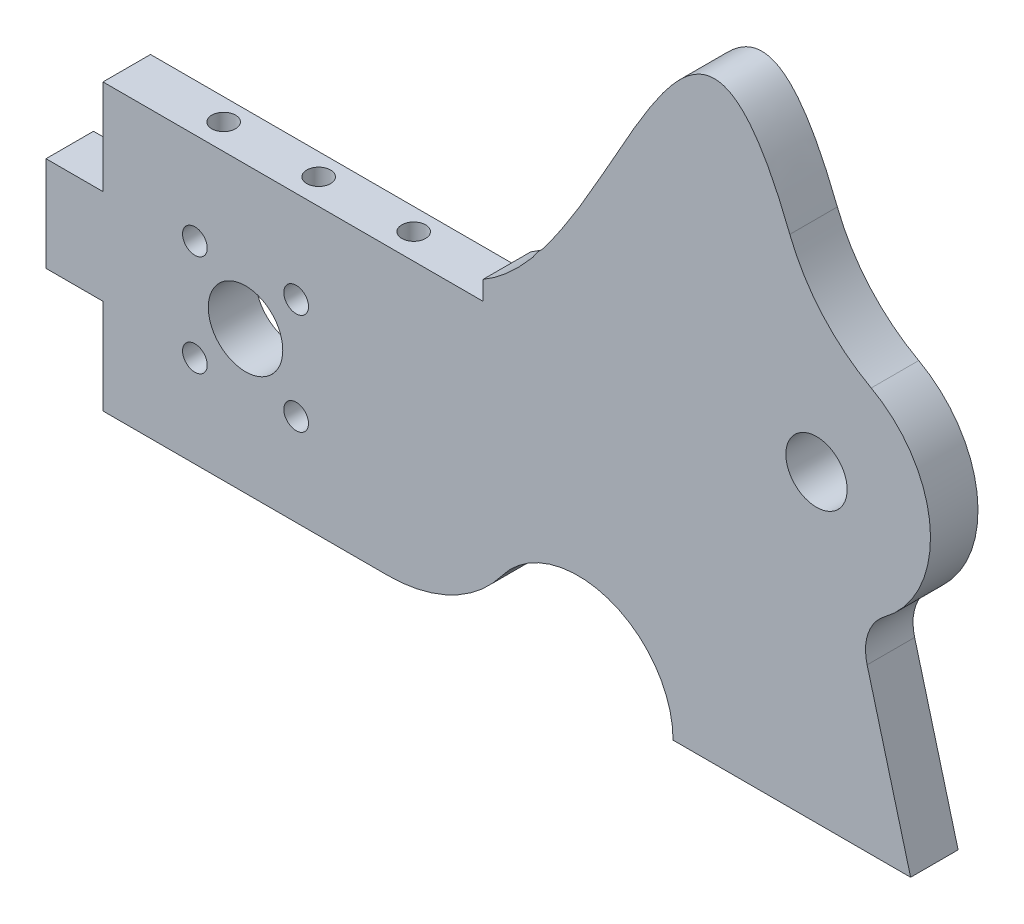
ISO-10303-21;
HEADER;
FILE_DESCRIPTION(('STEP AP214'),'2;1');
FILE_NAME('part.step','',(''),(''),'','','');
FILE_SCHEMA(('AUTOMOTIVE_DESIGN { 1 0 10303 214 1 1 1 1 }'));
ENDSEC;
DATA;
#1=APPLICATION_CONTEXT('core data for automotive mechanical design processes');
#2=APPLICATION_PROTOCOL_DEFINITION('international standard','automotive_design',2000,#1);
#3=PRODUCT_CONTEXT('',#1,'mechanical');
#4=PRODUCT('Part','Part','',(#3));
#5=PRODUCT_RELATED_PRODUCT_CATEGORY('part','',(#4));
#6=PRODUCT_DEFINITION_FORMATION('','',#4);
#7=PRODUCT_DEFINITION_CONTEXT('part definition',#1,'design');
#8=PRODUCT_DEFINITION('design','',#6,#7);
#9=PRODUCT_DEFINITION_SHAPE('','',#8);
#10=(LENGTH_UNIT() NAMED_UNIT(*) SI_UNIT(.MILLI.,.METRE.));
#11=(NAMED_UNIT(*) PLANE_ANGLE_UNIT() SI_UNIT($,.RADIAN.));
#12=(NAMED_UNIT(*) SI_UNIT($,.STERADIAN.) SOLID_ANGLE_UNIT());
#13=UNCERTAINTY_MEASURE_WITH_UNIT(LENGTH_MEASURE(1.E-05),#10,'distance_accuracy_value','');
#14=(GEOMETRIC_REPRESENTATION_CONTEXT(3) GLOBAL_UNCERTAINTY_ASSIGNED_CONTEXT((#13)) GLOBAL_UNIT_ASSIGNED_CONTEXT((#10,
#11,#12)) REPRESENTATION_CONTEXT('',''));
#15=CARTESIAN_POINT('',(0.,0.,0.));
#16=DIRECTION('',(0.,0.,1.));
#17=DIRECTION('',(1.,0.,0.));
#18=AXIS2_PLACEMENT_3D('',#15,#16,#17);
#19=CARTESIAN_POINT('',(0.,0.,6.35));
#20=DIRECTION('',(0.,1.,0.));
#21=DIRECTION('',(0.,0.,1.));
#22=AXIS2_PLACEMENT_3D('',#19,#20,#21);
#23=PLANE('',#22);
#24=CARTESIAN_POINT('',(31.75,0.,3.17500000000019));
#25=DIRECTION('',(0.,-1.,0.));
#26=DIRECTION('',(0.,0.,-1.));
#27=AXIS2_PLACEMENT_3D('',#24,#25,#26);
#28=CIRCLE('',#27,1.5875);
#29=CARTESIAN_POINT('',(31.75,0.,1.58750000000019));
#30=VERTEX_POINT('',#29);
#31=EDGE_CURVE('E523',#30,#30,#28,.T.);
#32=ORIENTED_EDGE('',*,*,#31,.F.);
#33=EDGE_LOOP('',(#32));
#34=FACE_BOUND('',#33,.T.);
#35=CARTESIAN_POINT('',(12.7,0.,3.17500000000019));
#36=DIRECTION('',(0.,-1.,0.));
#37=DIRECTION('',(0.,0.,-1.));
#38=AXIS2_PLACEMENT_3D('',#35,#36,#37);
#39=CIRCLE('',#38,1.5875);
#40=CARTESIAN_POINT('',(12.7,0.,1.58750000000019));
#41=VERTEX_POINT('',#40);
#42=EDGE_CURVE('E527',#41,#41,#39,.T.);
#43=ORIENTED_EDGE('',*,*,#42,.F.);
#44=EDGE_LOOP('',(#43));
#45=FACE_BOUND('',#44,.T.);
#46=DIRECTION('',(1.,0.,0.));
#47=VECTOR('',#46,1.);
#48=CARTESIAN_POINT('',(0.,0.,0.));
#49=LINE('',#48,#47);
#50=CARTESIAN_POINT('',(0.,0.,0.));
#51=VERTEX_POINT('',#50);
#52=CARTESIAN_POINT('',(38.1,0.,0.));
#53=VERTEX_POINT('',#52);
#54=EDGE_CURVE('E273',#51,#53,#49,.T.);
#55=ORIENTED_EDGE('',*,*,#54,.T.);
#56=DIRECTION('',(0.,0.,1.));
#57=VECTOR('',#56,1.);
#58=CARTESIAN_POINT('',(38.1,0.,6.35));
#59=LINE('',#58,#57);
#60=CARTESIAN_POINT('',(38.1,0.,6.35));
#61=VERTEX_POINT('',#60);
#62=EDGE_CURVE('E320',#53,#61,#59,.T.);
#63=ORIENTED_EDGE('',*,*,#62,.T.);
#64=DIRECTION('',(1.,0.,0.));
#65=VECTOR('',#64,1.);
#66=CARTESIAN_POINT('',(0.,0.,6.35));
#67=LINE('',#66,#65);
#68=CARTESIAN_POINT('',(0.,0.,6.35));
#69=VERTEX_POINT('',#68);
#70=EDGE_CURVE('E253',#69,#61,#67,.T.);
#71=ORIENTED_EDGE('',*,*,#70,.F.);
#72=DIRECTION('',(0.,0.,-1.));
#73=VECTOR('',#72,1.);
#74=CARTESIAN_POINT('',(0.,0.,6.35));
#75=LINE('',#74,#73);
#76=EDGE_CURVE('E305',#69,#51,#75,.T.);
#77=ORIENTED_EDGE('',*,*,#76,.T.);
#78=EDGE_LOOP('',(#55,#63,#71,#77));
#79=FACE_BOUND('',#78,.T.);
#80=ADVANCED_FACE('F34',(#34,#45,#79),#23,.F.);
#81=CARTESIAN_POINT('',(95.3674532925549,40.64,6.35));
#82=DIRECTION('',(0.,0.,1.));
#83=DIRECTION('',(1.,0.,0.));
#84=AXIS2_PLACEMENT_3D('',#81,#82,#83);
#85=PLANE('',#84);
#86=CARTESIAN_POINT('',(95.3674532925549,40.64,6.35));
#87=DIRECTION('',(0.,0.,1.));
#88=DIRECTION('',(1.,0.,0.));
#89=AXIS2_PLACEMENT_3D('',#86,#87,#88);
#90=CIRCLE('',#89,15.24);
#91=CARTESIAN_POINT('',(104.476824943284,28.4221054134157,6.35));
#92=VERTEX_POINT('',#91);
#93=CARTESIAN_POINT('',(102.682390609243,54.0097154813751,6.35));
#94=VERTEX_POINT('',#93);
#95=EDGE_CURVE('E259',#92,#94,#90,.T.);
#96=ORIENTED_EDGE('',*,*,#95,.T.);
#97=CARTESIAN_POINT('',(114.264374694,75.1784316602191,6.35));
#98=DIRECTION('',(0.,0.,1.));
#99=DIRECTION('',(1.,0.,0.));
#100=AXIS2_PLACEMENT_3D('',#97,#98,#99);
#101=CIRCLE('',#100,24.13);
#102=CARTESIAN_POINT('',(91.8054412375965,66.3549851680109,6.35));
#103=VERTEX_POINT('',#102);
#104=EDGE_CURVE('E11',#94,#103,#101,.F.);
#105=ORIENTED_EDGE('',*,*,#104,.T.);
#106=CARTESIAN_POINT('',(95.3674532925549,55.88,6.35));
#107=CARTESIAN_POINT('',(78.5942817419555,111.543427794669,6.35));
#108=CARTESIAN_POINT('',(70.7777889320371,52.1788036708753,6.35));
#109=CARTESIAN_POINT('',(50.8,40.64,6.35));
#110=B_SPLINE_CURVE_WITH_KNOTS('',3,(#106,#107,#108,#109),.UNSPECIFIED.,.F.,.F.,(4,4),(0.,1.),.UNSPECIFIED.);
#111=CARTESIAN_POINT('',(58.7253990221154,48.0986795360125,6.35));
#112=VERTEX_POINT('',#111);
#113=EDGE_CURVE('E170',#103,#112,#110,.T.);
#114=ORIENTED_EDGE('',*,*,#113,.T.);
#115=CARTESIAN_POINT('',(62.9766372231488,43.3817447518466,6.35));
#116=DIRECTION('',(0.,0.,1.));
#117=DIRECTION('',(1.,0.,0.));
#118=AXIS2_PLACEMENT_3D('',#115,#116,#117);
#119=CIRCLE('',#118,6.35);
#120=CARTESIAN_POINT('',(57.4616101020437,46.5292796370345,6.35));
#121=VERTEX_POINT('',#120);
#122=EDGE_CURVE('E178',#112,#121,#119,.T.);
#123=ORIENTED_EDGE('',*,*,#122,.T.);
#124=CARTESIAN_POINT('',(50.8000000000001,40.64,6.35));
#125=VERTEX_POINT('',#124);
#126=EDGE_CURVE('E816',#121,#125,#110,.T.);
#127=ORIENTED_EDGE('',*,*,#126,.T.);
#128=DIRECTION('',(0.,1.,0.));
#129=VECTOR('',#128,1.);
#130=CARTESIAN_POINT('',(50.8,38.1,6.35));
#131=LINE('',#130,#129);
#132=CARTESIAN_POINT('',(50.8,38.1,6.35));
#133=VERTEX_POINT('',#132);
#134=EDGE_CURVE('E177',#133,#125,#131,.T.);
#135=ORIENTED_EDGE('',*,*,#134,.F.);
#136=DIRECTION('',(1.,0.,0.));
#137=VECTOR('',#136,1.);
#138=CARTESIAN_POINT('',(0.,38.1,6.35));
#139=LINE('',#138,#137);
#140=CARTESIAN_POINT('',(0.,38.1,6.35));
#141=VERTEX_POINT('',#140);
#142=EDGE_CURVE('E819',#141,#133,#139,.T.);
#143=ORIENTED_EDGE('',*,*,#142,.F.);
#144=DIRECTION('',(0.,-1.,0.));
#145=VECTOR('',#144,1.);
#146=CARTESIAN_POINT('',(0.,38.1,6.35));
#147=LINE('',#146,#145);
#148=CARTESIAN_POINT('',(0.,25.4,6.35));
#149=VERTEX_POINT('',#148);
#150=EDGE_CURVE('E261',#141,#149,#147,.T.);
#151=ORIENTED_EDGE('',*,*,#150,.T.);
#152=DIRECTION('',(-1.,0.,0.));
#153=VECTOR('',#152,1.);
#154=CARTESIAN_POINT('',(0.,25.4,6.35));
#155=LINE('',#154,#153);
#156=CARTESIAN_POINT('',(-7.62,25.4,6.35));
#157=VERTEX_POINT('',#156);
#158=EDGE_CURVE('E263',#149,#157,#155,.T.);
#159=ORIENTED_EDGE('',*,*,#158,.T.);
#160=DIRECTION('',(0.,-1.,0.));
#161=VECTOR('',#160,1.);
#162=CARTESIAN_POINT('',(-7.62,25.4,6.35));
#163=LINE('',#162,#161);
#164=CARTESIAN_POINT('',(-7.62,12.7,6.35));
#165=VERTEX_POINT('',#164);
#166=EDGE_CURVE('E265',#157,#165,#163,.T.);
#167=ORIENTED_EDGE('',*,*,#166,.T.);
#168=DIRECTION('',(1.,0.,0.));
#169=VECTOR('',#168,1.);
#170=CARTESIAN_POINT('',(0.,12.7,6.35));
#171=LINE('',#170,#169);
#172=CARTESIAN_POINT('',(0.,12.7,6.35));
#173=VERTEX_POINT('',#172);
#174=EDGE_CURVE('E267',#165,#173,#171,.T.);
#175=ORIENTED_EDGE('',*,*,#174,.T.);
#176=DIRECTION('',(0.,-1.,0.));
#177=VECTOR('',#176,1.);
#178=CARTESIAN_POINT('',(0.,12.7,6.35));
#179=LINE('',#178,#177);
#180=EDGE_CURVE('E248',#173,#69,#179,.T.);
#181=ORIENTED_EDGE('',*,*,#180,.T.);
#182=ORIENTED_EDGE('',*,*,#70,.T.);
#183=CARTESIAN_POINT('',(38.1,19.05,6.35));
#184=DIRECTION('',(0.,0.,1.));
#185=DIRECTION('',(1.,0.,0.));
#186=AXIS2_PLACEMENT_3D('',#183,#184,#185);
#187=CIRCLE('',#186,19.05);
#188=CARTESIAN_POINT('',(53.34,7.62,6.35));
#189=VERTEX_POINT('',#188);
#190=EDGE_CURVE('E323',#61,#189,#187,.T.);
#191=ORIENTED_EDGE('',*,*,#190,.T.);
#192=CARTESIAN_POINT('',(63.5,0.,6.35));
#193=DIRECTION('',(0.,0.,1.));
#194=DIRECTION('',(1.,0.,0.));
#195=AXIS2_PLACEMENT_3D('',#192,#193,#194);
#196=CIRCLE('',#195,12.7);
#197=CARTESIAN_POINT('',(76.2,0.,6.35));
#198=VERTEX_POINT('',#197);
#199=EDGE_CURVE('E196',#198,#189,#196,.T.);
#200=ORIENTED_EDGE('',*,*,#199,.F.);
#201=CARTESIAN_POINT('',(107.95,0.,6.35));
#202=VERTEX_POINT('',#201);
#203=EDGE_CURVE('E251',#198,#202,#67,.T.);
#204=ORIENTED_EDGE('',*,*,#203,.T.);
#205=DIRECTION('',(-0.258819045102525,0.965925826289067,0.));
#206=VECTOR('',#205,1.);
#207=CARTESIAN_POINT('',(107.95,0.,6.35));
#208=LINE('',#207,#206);
#209=CARTESIAN_POINT('',(102.138767467486,21.6878150659382,6.35));
#210=VERTEX_POINT('',#209);
#211=EDGE_CURVE('E256',#202,#210,#208,.T.);
#212=ORIENTED_EDGE('',*,*,#211,.T.);
#213=CARTESIAN_POINT('',(108.272396464422,23.3313160023389,6.35));
#214=DIRECTION('',(0.,0.,1.));
#215=DIRECTION('',(1.,0.,0.));
#216=AXIS2_PLACEMENT_3D('',#213,#214,#215);
#217=CIRCLE('',#216,6.35);
#218=EDGE_CURVE('E179',#210,#92,#217,.F.);
#219=ORIENTED_EDGE('',*,*,#218,.T.);
#220=EDGE_LOOP('',(#96,#105,#114,#123,#127,#135,#143,#151,#159,#167,#175,#181,#182,#191,#200,
#204,#212,#219));
#221=FACE_BOUND('',#220,.T.);
#222=CARTESIAN_POINT('',(19.05,19.05,6.35));
#223=DIRECTION('',(0.,0.,1.));
#224=DIRECTION('',(1.,0.,0.));
#225=AXIS2_PLACEMENT_3D('',#222,#223,#224);
#226=CIRCLE('',#225,4.9784);
#227=CARTESIAN_POINT('',(24.0284,19.05,6.35));
#228=VERTEX_POINT('',#227);
#229=EDGE_CURVE('E186',#228,#228,#226,.T.);
#230=ORIENTED_EDGE('',*,*,#229,.F.);
#231=EDGE_LOOP('',(#230));
#232=FACE_BOUND('',#231,.T.);
#233=CARTESIAN_POINT('',(12.2829881040447,12.2829881040447,6.35));
#234=DIRECTION('',(0.,0.,1.));
#235=DIRECTION('',(1.,0.,0.));
#236=AXIS2_PLACEMENT_3D('',#233,#234,#235);
#237=CIRCLE('',#236,1.65099999999998);
#238=CARTESIAN_POINT('',(13.9339881040447,12.2829881040447,6.35));
#239=VERTEX_POINT('',#238);
#240=EDGE_CURVE('E224',#239,#239,#237,.T.);
#241=ORIENTED_EDGE('',*,*,#240,.F.);
#242=EDGE_LOOP('',(#241));
#243=FACE_BOUND('',#242,.T.);
#244=CARTESIAN_POINT('',(25.8170118959553,25.8170118959552,6.35));
#245=DIRECTION('',(0.,0.,1.));
#246=DIRECTION('',(1.,0.,0.));
#247=AXIS2_PLACEMENT_3D('',#244,#245,#246);
#248=CIRCLE('',#247,1.65099999999998);
#249=CARTESIAN_POINT('',(27.4680118959552,25.8170118959552,6.35));
#250=VERTEX_POINT('',#249);
#251=EDGE_CURVE('E236',#250,#250,#248,.T.);
#252=ORIENTED_EDGE('',*,*,#251,.F.);
#253=EDGE_LOOP('',(#252));
#254=FACE_BOUND('',#253,.T.);
#255=CARTESIAN_POINT('',(95.3674532925549,40.64,6.35));
#256=DIRECTION('',(0.,0.,1.));
#257=DIRECTION('',(1.,0.,0.));
#258=AXIS2_PLACEMENT_3D('',#255,#256,#257);
#259=CIRCLE('',#258,4.09574999999999);
#260=CARTESIAN_POINT('',(99.4632032925549,40.64,6.35));
#261=VERTEX_POINT('',#260);
#262=EDGE_CURVE('E242',#261,#261,#259,.T.);
#263=ORIENTED_EDGE('',*,*,#262,.F.);
#264=EDGE_LOOP('',(#263));
#265=FACE_BOUND('',#264,.T.);
#266=CARTESIAN_POINT('',(25.8170118959553,12.2829881040447,6.35));
#267=DIRECTION('',(0.,0.,1.));
#268=DIRECTION('',(1.,0.,0.));
#269=AXIS2_PLACEMENT_3D('',#266,#267,#268);
#270=CIRCLE('',#269,1.65099999999998);
#271=CARTESIAN_POINT('',(27.4680118959552,12.2829881040447,6.35));
#272=VERTEX_POINT('',#271);
#273=EDGE_CURVE('E230',#272,#272,#270,.T.);
#274=ORIENTED_EDGE('',*,*,#273,.F.);
#275=EDGE_LOOP('',(#274));
#276=FACE_BOUND('',#275,.T.);
#277=CARTESIAN_POINT('',(12.2829881040448,25.8170118959553,6.35));
#278=DIRECTION('',(0.,0.,1.));
#279=DIRECTION('',(1.,0.,0.));
#280=AXIS2_PLACEMENT_3D('',#277,#278,#279);
#281=CIRCLE('',#280,1.65099999999999);
#282=CARTESIAN_POINT('',(13.9339881040447,25.8170118959553,6.35));
#283=VERTEX_POINT('',#282);
#284=EDGE_CURVE('E218',#283,#283,#281,.T.);
#285=ORIENTED_EDGE('',*,*,#284,.F.);
#286=EDGE_LOOP('',(#285));
#287=FACE_BOUND('',#286,.T.);
#288=ADVANCED_FACE('F470',(#221,#232,#243,#254,#265,#276,#287),#85,.T.);
#289=CARTESIAN_POINT('',(95.3674532925549,40.64,0.));
#290=DIRECTION('',(0.,0.,1.));
#291=DIRECTION('',(1.,0.,0.));
#292=AXIS2_PLACEMENT_3D('',#289,#290,#291);
#293=PLANE('',#292);
#294=CARTESIAN_POINT('',(95.3674532925549,55.88,0.));
#295=CARTESIAN_POINT('',(78.5942817419555,111.543427794669,0.));
#296=CARTESIAN_POINT('',(70.7777889320371,52.1788036708753,0.));
#297=CARTESIAN_POINT('',(50.8,40.64,0.));
#298=B_SPLINE_CURVE_WITH_KNOTS('',3,(#294,#295,#296,#297),.UNSPECIFIED.,.F.,.F.,(4,4),(0.,1.),.UNSPECIFIED.);
#299=CARTESIAN_POINT('',(91.8054412375965,66.3549851680109,0.));
#300=VERTEX_POINT('',#299);
#301=CARTESIAN_POINT('',(58.7253990221154,48.0986795360125,0.));
#302=VERTEX_POINT('',#301);
#303=EDGE_CURVE('E169',#300,#302,#298,.T.);
#304=ORIENTED_EDGE('',*,*,#303,.F.);
#305=CARTESIAN_POINT('',(114.264374694,75.1784316602191,0.));
#306=DIRECTION('',(0.,0.,1.));
#307=DIRECTION('',(1.,0.,0.));
#308=AXIS2_PLACEMENT_3D('',#305,#306,#307);
#309=CIRCLE('',#308,24.13);
#310=CARTESIAN_POINT('',(102.682390609243,54.0097154813751,0.));
#311=VERTEX_POINT('',#310);
#312=EDGE_CURVE('E42',#300,#311,#309,.T.);
#313=ORIENTED_EDGE('',*,*,#312,.T.);
#314=CARTESIAN_POINT('',(95.3674532925549,40.64,0.));
#315=DIRECTION('',(0.,0.,1.));
#316=DIRECTION('',(1.,0.,0.));
#317=AXIS2_PLACEMENT_3D('',#314,#315,#316);
#318=CIRCLE('',#317,15.24);
#319=CARTESIAN_POINT('',(104.476824943284,28.4221054134157,0.));
#320=VERTEX_POINT('',#319);
#321=EDGE_CURVE('E279',#320,#311,#318,.T.);
#322=ORIENTED_EDGE('',*,*,#321,.F.);
#323=CARTESIAN_POINT('',(108.272396464422,23.3313160023389,0.));
#324=DIRECTION('',(0.,0.,1.));
#325=DIRECTION('',(1.,0.,0.));
#326=AXIS2_PLACEMENT_3D('',#323,#324,#325);
#327=CIRCLE('',#326,6.35);
#328=CARTESIAN_POINT('',(102.138767467486,21.6878150659382,0.));
#329=VERTEX_POINT('',#328);
#330=EDGE_CURVE('E313',#320,#329,#327,.T.);
#331=ORIENTED_EDGE('',*,*,#330,.T.);
#332=DIRECTION('',(-0.258819045102477,0.96592582628908,0.));
#333=VECTOR('',#332,1.);
#334=CARTESIAN_POINT('',(100.936260599847,26.1756317924197,0.));
#335=LINE('',#334,#333);
#336=CARTESIAN_POINT('',(107.95,0.,0.));
#337=VERTEX_POINT('',#336);
#338=EDGE_CURVE('E276',#337,#329,#335,.T.);
#339=ORIENTED_EDGE('',*,*,#338,.F.);
#340=CARTESIAN_POINT('',(76.2,0.,0.));
#341=VERTEX_POINT('',#340);
#342=EDGE_CURVE('E272',#341,#337,#49,.T.);
#343=ORIENTED_EDGE('',*,*,#342,.F.);
#344=CARTESIAN_POINT('',(63.5,0.,0.));
#345=DIRECTION('',(0.,0.,1.));
#346=DIRECTION('',(1.,0.,0.));
#347=AXIS2_PLACEMENT_3D('',#344,#345,#346);
#348=CIRCLE('',#347,12.7);
#349=CARTESIAN_POINT('',(53.34,7.62,0.));
#350=VERTEX_POINT('',#349);
#351=EDGE_CURVE('E198',#341,#350,#348,.T.);
#352=ORIENTED_EDGE('',*,*,#351,.T.);
#353=CARTESIAN_POINT('',(38.1,19.05,0.));
#354=DIRECTION('',(0.,0.,1.));
#355=DIRECTION('',(1.,0.,0.));
#356=AXIS2_PLACEMENT_3D('',#353,#354,#355);
#357=CIRCLE('',#356,19.05);
#358=EDGE_CURVE('E327',#350,#53,#357,.F.);
#359=ORIENTED_EDGE('',*,*,#358,.T.);
#360=ORIENTED_EDGE('',*,*,#54,.F.);
#361=DIRECTION('',(0.,-1.,0.));
#362=VECTOR('',#361,1.);
#363=CARTESIAN_POINT('',(0.,12.7,0.));
#364=LINE('',#363,#362);
#365=CARTESIAN_POINT('',(0.,12.7,0.));
#366=VERTEX_POINT('',#365);
#367=EDGE_CURVE('E245',#366,#51,#364,.T.);
#368=ORIENTED_EDGE('',*,*,#367,.F.);
#369=DIRECTION('',(1.,0.,0.));
#370=VECTOR('',#369,1.);
#371=CARTESIAN_POINT('',(0.,12.7,0.));
#372=LINE('',#371,#370);
#373=CARTESIAN_POINT('',(-7.62,12.7,0.));
#374=VERTEX_POINT('',#373);
#375=EDGE_CURVE('E252',#374,#366,#372,.T.);
#376=ORIENTED_EDGE('',*,*,#375,.F.);
#377=DIRECTION('',(0.,-1.,0.));
#378=VECTOR('',#377,1.);
#379=CARTESIAN_POINT('',(-7.62,25.4,0.));
#380=LINE('',#379,#378);
#381=CARTESIAN_POINT('',(-7.62,25.4,0.));
#382=VERTEX_POINT('',#381);
#383=EDGE_CURVE('E285',#382,#374,#380,.T.);
#384=ORIENTED_EDGE('',*,*,#383,.F.);
#385=DIRECTION('',(-1.,0.,0.));
#386=VECTOR('',#385,1.);
#387=CARTESIAN_POINT('',(0.,25.4,0.));
#388=LINE('',#387,#386);
#389=CARTESIAN_POINT('',(0.,25.4,0.));
#390=VERTEX_POINT('',#389);
#391=EDGE_CURVE('E283',#390,#382,#388,.T.);
#392=ORIENTED_EDGE('',*,*,#391,.F.);
#393=DIRECTION('',(0.,-1.,0.));
#394=VECTOR('',#393,1.);
#395=CARTESIAN_POINT('',(0.,38.1,0.));
#396=LINE('',#395,#394);
#397=CARTESIAN_POINT('',(0.,38.1,0.));
#398=VERTEX_POINT('',#397);
#399=EDGE_CURVE('E281',#398,#390,#396,.T.);
#400=ORIENTED_EDGE('',*,*,#399,.F.);
#401=DIRECTION('',(1.,0.,0.));
#402=VECTOR('',#401,1.);
#403=CARTESIAN_POINT('',(95.3674532925549,38.1,0.));
#404=LINE('',#403,#402);
#405=CARTESIAN_POINT('',(50.8,38.1,0.));
#406=VERTEX_POINT('',#405);
#407=EDGE_CURVE('E185',#398,#406,#404,.T.);
#408=ORIENTED_EDGE('',*,*,#407,.T.);
#409=DIRECTION('',(0.,1.,0.));
#410=VECTOR('',#409,1.);
#411=CARTESIAN_POINT('',(50.8,40.64,0.));
#412=LINE('',#411,#410);
#413=CARTESIAN_POINT('',(50.8000000000001,40.64,0.));
#414=VERTEX_POINT('',#413);
#415=EDGE_CURVE('E174',#406,#414,#412,.T.);
#416=ORIENTED_EDGE('',*,*,#415,.T.);
#417=CARTESIAN_POINT('',(57.4616101020437,46.5292796370345,0.));
#418=VERTEX_POINT('',#417);
#419=EDGE_CURVE('E159',#418,#414,#298,.T.);
#420=ORIENTED_EDGE('',*,*,#419,.F.);
#421=CARTESIAN_POINT('',(62.9766372231488,43.3817447518466,0.));
#422=DIRECTION('',(0.,0.,1.));
#423=DIRECTION('',(1.,0.,0.));
#424=AXIS2_PLACEMENT_3D('',#421,#422,#423);
#425=CIRCLE('',#424,6.35);
#426=EDGE_CURVE('E318',#418,#302,#425,.F.);
#427=ORIENTED_EDGE('',*,*,#426,.T.);
#428=EDGE_LOOP('',(#304,#313,#322,#331,#339,#343,#352,#359,#360,#368,#376,#384,#392,#400,#408,
#416,#420,#427));
#429=FACE_BOUND('',#428,.T.);
#430=CARTESIAN_POINT('',(19.05,19.05,0.));
#431=DIRECTION('',(0.,0.,1.));
#432=DIRECTION('',(1.,0.,0.));
#433=AXIS2_PLACEMENT_3D('',#430,#431,#432);
#434=CIRCLE('',#433,4.9784);
#435=CARTESIAN_POINT('',(24.0284,19.05,0.));
#436=VERTEX_POINT('',#435);
#437=EDGE_CURVE('E189',#436,#436,#434,.T.);
#438=ORIENTED_EDGE('',*,*,#437,.T.);
#439=EDGE_LOOP('',(#438));
#440=FACE_BOUND('',#439,.T.);
#441=CARTESIAN_POINT('',(95.3674532925549,40.64,0.));
#442=DIRECTION('',(0.,0.,1.));
#443=DIRECTION('',(1.,0.,0.));
#444=AXIS2_PLACEMENT_3D('',#441,#442,#443);
#445=CIRCLE('',#444,4.09574999999999);
#446=CARTESIAN_POINT('',(99.4632032925549,40.64,0.));
#447=VERTEX_POINT('',#446);
#448=EDGE_CURVE('E239',#447,#447,#445,.T.);
#449=ORIENTED_EDGE('',*,*,#448,.T.);
#450=EDGE_LOOP('',(#449));
#451=FACE_BOUND('',#450,.T.);
#452=CARTESIAN_POINT('',(25.8170118959553,25.8170118959552,0.));
#453=DIRECTION('',(0.,0.,1.));
#454=DIRECTION('',(1.,0.,0.));
#455=AXIS2_PLACEMENT_3D('',#452,#453,#454);
#456=CIRCLE('',#455,1.65099999999998);
#457=CARTESIAN_POINT('',(27.4680118959552,25.8170118959552,0.));
#458=VERTEX_POINT('',#457);
#459=EDGE_CURVE('E233',#458,#458,#456,.T.);
#460=ORIENTED_EDGE('',*,*,#459,.T.);
#461=EDGE_LOOP('',(#460));
#462=FACE_BOUND('',#461,.T.);
#463=CARTESIAN_POINT('',(25.8170118959553,12.2829881040447,0.));
#464=DIRECTION('',(0.,0.,1.));
#465=DIRECTION('',(1.,0.,0.));
#466=AXIS2_PLACEMENT_3D('',#463,#464,#465);
#467=CIRCLE('',#466,1.65099999999998);
#468=CARTESIAN_POINT('',(27.4680118959552,12.2829881040447,0.));
#469=VERTEX_POINT('',#468);
#470=EDGE_CURVE('E227',#469,#469,#467,.T.);
#471=ORIENTED_EDGE('',*,*,#470,.T.);
#472=EDGE_LOOP('',(#471));
#473=FACE_BOUND('',#472,.T.);
#474=CARTESIAN_POINT('',(12.2829881040447,12.2829881040447,0.));
#475=DIRECTION('',(0.,0.,1.));
#476=DIRECTION('',(1.,0.,0.));
#477=AXIS2_PLACEMENT_3D('',#474,#475,#476);
#478=CIRCLE('',#477,1.65099999999998);
#479=CARTESIAN_POINT('',(13.9339881040447,12.2829881040447,0.));
#480=VERTEX_POINT('',#479);
#481=EDGE_CURVE('E221',#480,#480,#478,.T.);
#482=ORIENTED_EDGE('',*,*,#481,.T.);
#483=EDGE_LOOP('',(#482));
#484=FACE_BOUND('',#483,.T.);
#485=CARTESIAN_POINT('',(12.2829881040448,25.8170118959553,0.));
#486=DIRECTION('',(0.,0.,1.));
#487=DIRECTION('',(1.,0.,0.));
#488=AXIS2_PLACEMENT_3D('',#485,#486,#487);
#489=CIRCLE('',#488,1.65099999999999);
#490=CARTESIAN_POINT('',(13.9339881040447,25.8170118959553,0.));
#491=VERTEX_POINT('',#490);
#492=EDGE_CURVE('E209',#491,#491,#489,.T.);
#493=ORIENTED_EDGE('',*,*,#492,.T.);
#494=EDGE_LOOP('',(#493));
#495=FACE_BOUND('',#494,.T.);
#496=ADVANCED_FACE('F182',(#429,#440,#451,#462,#473,#484,#495),#293,.F.);
#497=CARTESIAN_POINT('',(0.,12.7,6.35));
#498=DIRECTION('',(1.,0.,0.));
#499=DIRECTION('',(0.,1.,0.));
#500=AXIS2_PLACEMENT_3D('',#497,#498,#499);
#501=PLANE('',#500);
#502=CARTESIAN_POINT('',(0.,6.35,3.175));
#503=DIRECTION('',(-1.,0.,0.));
#504=DIRECTION('',(0.,-1.,0.));
#505=AXIS2_PLACEMENT_3D('',#502,#503,#504);
#506=CIRCLE('',#505,1.5875);
#507=CARTESIAN_POINT('',(0.,4.7625,3.175));
#508=VERTEX_POINT('',#507);
#509=EDGE_CURVE('E205',#508,#508,#506,.T.);
#510=ORIENTED_EDGE('',*,*,#509,.F.);
#511=EDGE_LOOP('',(#510));
#512=FACE_BOUND('',#511,.T.);
#513=ORIENTED_EDGE('',*,*,#367,.T.);
#514=ORIENTED_EDGE('',*,*,#76,.F.);
#515=ORIENTED_EDGE('',*,*,#180,.F.);
#516=DIRECTION('',(0.,0.,-1.));
#517=VECTOR('',#516,1.);
#518=CARTESIAN_POINT('',(0.,12.7,6.35));
#519=LINE('',#518,#517);
#520=EDGE_CURVE('E269',#173,#366,#519,.T.);
#521=ORIENTED_EDGE('',*,*,#520,.T.);
#522=EDGE_LOOP('',(#513,#514,#515,#521));
#523=FACE_BOUND('',#522,.T.);
#524=ADVANCED_FACE('F476',(#512,#523),#501,.F.);
#525=CARTESIAN_POINT('',(97.79,0.,3.17500000000019));
#526=DIRECTION('',(0.,-1.,0.));
#527=DIRECTION('',(0.,0.,-1.));
#528=AXIS2_PLACEMENT_3D('',#525,#526,#527);
#529=CIRCLE('',#528,1.5875);
#530=CARTESIAN_POINT('',(97.79,0.,1.58750000000019));
#531=VERTEX_POINT('',#530);
#532=EDGE_CURVE('E840',#531,#531,#529,.T.);
#533=ORIENTED_EDGE('',*,*,#532,.F.);
#534=EDGE_LOOP('',(#533));
#535=FACE_BOUND('',#534,.T.);
#536=CARTESIAN_POINT('',(86.36,0.,3.17500000000019));
#537=DIRECTION('',(0.,-1.,0.));
#538=DIRECTION('',(0.,0.,-1.));
#539=AXIS2_PLACEMENT_3D('',#536,#537,#538);
#540=CIRCLE('',#539,1.5875);
#541=CARTESIAN_POINT('',(86.36,0.,1.58750000000019));
#542=VERTEX_POINT('',#541);
#543=EDGE_CURVE('E834',#542,#542,#540,.T.);
#544=ORIENTED_EDGE('',*,*,#543,.F.);
#545=EDGE_LOOP('',(#544));
#546=FACE_BOUND('',#545,.T.);
#547=ORIENTED_EDGE('',*,*,#203,.F.);
#548=DIRECTION('',(0.,0.,1.));
#549=VECTOR('',#548,1.);
#550=CARTESIAN_POINT('',(76.2,0.,0.));
#551=LINE('',#550,#549);
#552=EDGE_CURVE('E201',#341,#198,#551,.T.);
#553=ORIENTED_EDGE('',*,*,#552,.F.);
#554=ORIENTED_EDGE('',*,*,#342,.T.);
#555=DIRECTION('',(0.,0.,-1.));
#556=VECTOR('',#555,1.);
#557=CARTESIAN_POINT('',(107.95,0.,6.35));
#558=LINE('',#557,#556);
#559=EDGE_CURVE('E302',#202,#337,#558,.T.);
#560=ORIENTED_EDGE('',*,*,#559,.F.);
#561=EDGE_LOOP('',(#547,#553,#554,#560));
#562=FACE_BOUND('',#561,.T.);
#563=ADVANCED_FACE('F498',(#535,#546,#562),#23,.F.);
#564=CARTESIAN_POINT('',(100.936260599847,26.1756317924197,6.35));
#565=DIRECTION('',(-0.96592582628908,-0.258819045102477,0.));
#566=DIRECTION('',(0.258819045102477,-0.96592582628908,0.));
#567=AXIS2_PLACEMENT_3D('',#564,#565,#566);
#568=PLANE('',#567);
#569=ORIENTED_EDGE('',*,*,#338,.T.);
#570=DIRECTION('',(0.,0.,1.));
#571=VECTOR('',#570,1.);
#572=CARTESIAN_POINT('',(102.138767467486,21.6878150659382,6.35));
#573=LINE('',#572,#571);
#574=EDGE_CURVE('E311',#329,#210,#573,.T.);
#575=ORIENTED_EDGE('',*,*,#574,.T.);
#576=ORIENTED_EDGE('',*,*,#211,.F.);
#577=ORIENTED_EDGE('',*,*,#559,.T.);
#578=EDGE_LOOP('',(#569,#575,#576,#577));
#579=FACE_BOUND('',#578,.T.);
#580=ADVANCED_FACE('F495',(#579),#568,.F.);
#581=CARTESIAN_POINT('',(95.3674532925549,40.64,6.35));
#582=DIRECTION('',(0.,0.,-1.));
#583=DIRECTION('',(-1.,0.,0.));
#584=AXIS2_PLACEMENT_3D('',#581,#582,#583);
#585=CYLINDRICAL_SURFACE('',#584,15.24);
#586=ORIENTED_EDGE('',*,*,#321,.T.);
#587=DIRECTION('',(0.,0.,-1.));
#588=VECTOR('',#587,1.);
#589=CARTESIAN_POINT('',(102.682390609243,54.0097154813751,6.35));
#590=LINE('',#589,#588);
#591=EDGE_CURVE('E55',#311,#94,#590,.F.);
#592=ORIENTED_EDGE('',*,*,#591,.T.);
#593=ORIENTED_EDGE('',*,*,#95,.F.);
#594=DIRECTION('',(0.,0.,-1.));
#595=VECTOR('',#594,1.);
#596=CARTESIAN_POINT('',(104.476824943284,28.4221054134157,6.35));
#597=LINE('',#596,#595);
#598=EDGE_CURVE('E308',#92,#320,#597,.T.);
#599=ORIENTED_EDGE('',*,*,#598,.T.);
#600=EDGE_LOOP('',(#586,#592,#593,#599));
#601=FACE_BOUND('',#600,.T.);
#602=ADVANCED_FACE('F491',(#601),#585,.T.);
#603=CARTESIAN_POINT('',(0.,38.1,6.35));
#604=DIRECTION('',(1.,0.,0.));
#605=DIRECTION('',(0.,1.,0.));
#606=AXIS2_PLACEMENT_3D('',#603,#604,#605);
#607=PLANE('',#606);
#608=CARTESIAN_POINT('',(0.,31.75,3.175));
#609=DIRECTION('',(-1.,0.,0.));
#610=DIRECTION('',(0.,-1.,0.));
#611=AXIS2_PLACEMENT_3D('',#608,#609,#610);
#612=CIRCLE('',#611,1.5875);
#613=CARTESIAN_POINT('',(0.,30.1625,3.175));
#614=VERTEX_POINT('',#613);
#615=EDGE_CURVE('E210',#614,#614,#612,.T.);
#616=ORIENTED_EDGE('',*,*,#615,.F.);
#617=EDGE_LOOP('',(#616));
#618=FACE_BOUND('',#617,.T.);
#619=ORIENTED_EDGE('',*,*,#399,.T.);
#620=DIRECTION('',(0.,0.,-1.));
#621=VECTOR('',#620,1.);
#622=CARTESIAN_POINT('',(0.,25.4,6.35));
#623=LINE('',#622,#621);
#624=EDGE_CURVE('E296',#149,#390,#623,.T.);
#625=ORIENTED_EDGE('',*,*,#624,.F.);
#626=ORIENTED_EDGE('',*,*,#150,.F.);
#627=DIRECTION('',(0.,0.,-1.));
#628=VECTOR('',#627,1.);
#629=CARTESIAN_POINT('',(0.,38.1,6.35));
#630=LINE('',#629,#628);
#631=EDGE_CURVE('E299',#141,#398,#630,.T.);
#632=ORIENTED_EDGE('',*,*,#631,.T.);
#633=EDGE_LOOP('',(#619,#625,#626,#632));
#634=FACE_BOUND('',#633,.T.);
#635=ADVANCED_FACE('F487',(#618,#634),#607,.F.);
#636=CARTESIAN_POINT('',(0.,25.4,6.35));
#637=DIRECTION('',(0.,-1.,0.));
#638=DIRECTION('',(0.,0.,-1.));
#639=AXIS2_PLACEMENT_3D('',#636,#637,#638);
#640=PLANE('',#639);
#641=ORIENTED_EDGE('',*,*,#391,.T.);
#642=DIRECTION('',(0.,0.,-1.));
#643=VECTOR('',#642,1.);
#644=CARTESIAN_POINT('',(-7.62,25.4,6.35));
#645=LINE('',#644,#643);
#646=EDGE_CURVE('E293',#157,#382,#645,.T.);
#647=ORIENTED_EDGE('',*,*,#646,.F.);
#648=ORIENTED_EDGE('',*,*,#158,.F.);
#649=ORIENTED_EDGE('',*,*,#624,.T.);
#650=EDGE_LOOP('',(#641,#647,#648,#649));
#651=FACE_BOUND('',#650,.T.);
#652=ADVANCED_FACE('F483',(#651),#640,.F.);
#653=CARTESIAN_POINT('',(-7.62,25.4,6.35));
#654=DIRECTION('',(1.,0.,0.));
#655=DIRECTION('',(0.,1.,0.));
#656=AXIS2_PLACEMENT_3D('',#653,#654,#655);
#657=PLANE('',#656);
#658=ORIENTED_EDGE('',*,*,#383,.T.);
#659=DIRECTION('',(0.,0.,-1.));
#660=VECTOR('',#659,1.);
#661=CARTESIAN_POINT('',(-7.62,12.7,6.35));
#662=LINE('',#661,#660);
#663=EDGE_CURVE('E290',#165,#374,#662,.T.);
#664=ORIENTED_EDGE('',*,*,#663,.F.);
#665=ORIENTED_EDGE('',*,*,#166,.F.);
#666=ORIENTED_EDGE('',*,*,#646,.T.);
#667=EDGE_LOOP('',(#658,#664,#665,#666));
#668=FACE_BOUND('',#667,.T.);
#669=ADVANCED_FACE('F479',(#668),#657,.F.);
#670=CARTESIAN_POINT('',(0.,12.7,6.35));
#671=DIRECTION('',(0.,1.,0.));
#672=DIRECTION('',(-1.,0.,0.));
#673=AXIS2_PLACEMENT_3D('',#670,#671,#672);
#674=PLANE('',#673);
#675=ORIENTED_EDGE('',*,*,#375,.T.);
#676=ORIENTED_EDGE('',*,*,#520,.F.);
#677=ORIENTED_EDGE('',*,*,#174,.F.);
#678=ORIENTED_EDGE('',*,*,#663,.T.);
#679=EDGE_LOOP('',(#675,#676,#677,#678));
#680=FACE_BOUND('',#679,.T.);
#681=ADVANCED_FACE('F468',(#680),#674,.F.);
#682=CARTESIAN_POINT('',(95.3674532925549,40.64,6.35));
#683=DIRECTION('',(0.,0.,-1.));
#684=DIRECTION('',(-1.,0.,0.));
#685=AXIS2_PLACEMENT_3D('',#682,#683,#684);
#686=CYLINDRICAL_SURFACE('',#685,4.09574999999999);
#687=ORIENTED_EDGE('',*,*,#262,.T.);
#688=EDGE_LOOP('',(#687));
#689=FACE_BOUND('',#688,.T.);
#690=ORIENTED_EDGE('',*,*,#448,.F.);
#691=EDGE_LOOP('',(#690));
#692=FACE_BOUND('',#691,.T.);
#693=ADVANCED_FACE('F464',(#689,#692),#686,.F.);
#694=CARTESIAN_POINT('',(25.8170118959553,25.8170118959552,6.35));
#695=DIRECTION('',(0.,0.,-1.));
#696=DIRECTION('',(-1.,0.,0.));
#697=AXIS2_PLACEMENT_3D('',#694,#695,#696);
#698=CYLINDRICAL_SURFACE('',#697,1.65099999999998);
#699=ORIENTED_EDGE('',*,*,#251,.T.);
#700=EDGE_LOOP('',(#699));
#701=FACE_BOUND('',#700,.T.);
#702=ORIENTED_EDGE('',*,*,#459,.F.);
#703=EDGE_LOOP('',(#702));
#704=FACE_BOUND('',#703,.T.);
#705=ADVANCED_FACE('F460',(#701,#704),#698,.F.);
#706=CARTESIAN_POINT('',(25.8170118959553,12.2829881040447,6.35));
#707=DIRECTION('',(0.,0.,-1.));
#708=DIRECTION('',(-1.,0.,0.));
#709=AXIS2_PLACEMENT_3D('',#706,#707,#708);
#710=CYLINDRICAL_SURFACE('',#709,1.65099999999998);
#711=ORIENTED_EDGE('',*,*,#273,.T.);
#712=EDGE_LOOP('',(#711));
#713=FACE_BOUND('',#712,.T.);
#714=ORIENTED_EDGE('',*,*,#470,.F.);
#715=EDGE_LOOP('',(#714));
#716=FACE_BOUND('',#715,.T.);
#717=ADVANCED_FACE('F456',(#713,#716),#710,.F.);
#718=CARTESIAN_POINT('',(12.2829881040447,12.2829881040447,6.35));
#719=DIRECTION('',(0.,0.,-1.));
#720=DIRECTION('',(-1.,0.,0.));
#721=AXIS2_PLACEMENT_3D('',#718,#719,#720);
#722=CYLINDRICAL_SURFACE('',#721,1.65099999999998);
#723=ORIENTED_EDGE('',*,*,#240,.T.);
#724=EDGE_LOOP('',(#723));
#725=FACE_BOUND('',#724,.T.);
#726=ORIENTED_EDGE('',*,*,#481,.F.);
#727=EDGE_LOOP('',(#726));
#728=FACE_BOUND('',#727,.T.);
#729=ADVANCED_FACE('F452',(#725,#728),#722,.F.);
#730=CARTESIAN_POINT('',(12.2829881040448,25.8170118959553,6.35));
#731=DIRECTION('',(0.,0.,-1.));
#732=DIRECTION('',(-1.,0.,0.));
#733=AXIS2_PLACEMENT_3D('',#730,#731,#732);
#734=CYLINDRICAL_SURFACE('',#733,1.65099999999999);
#735=ORIENTED_EDGE('',*,*,#284,.T.);
#736=EDGE_LOOP('',(#735));
#737=FACE_BOUND('',#736,.T.);
#738=ORIENTED_EDGE('',*,*,#492,.F.);
#739=EDGE_LOOP('',(#738));
#740=FACE_BOUND('',#739,.T.);
#741=ADVANCED_FACE('F442',(#737,#740),#734,.F.);
#742=CARTESIAN_POINT('',(6.34999999999999,31.75,3.175));
#743=DIRECTION('',(-1.,0.,0.));
#744=DIRECTION('',(0.,-1.,0.));
#745=AXIS2_PLACEMENT_3D('',#742,#743,#744);
#746=CYLINDRICAL_SURFACE('',#745,1.5875);
#747=CARTESIAN_POINT('',(6.34999999999999,31.75,3.175));
#748=DIRECTION('',(-1.,0.,0.));
#749=DIRECTION('',(0.,-1.,0.));
#750=AXIS2_PLACEMENT_3D('',#747,#748,#749);
#751=CIRCLE('',#750,1.5875);
#752=CARTESIAN_POINT('',(6.34999999999999,30.1625,3.175));
#753=VERTEX_POINT('',#752);
#754=EDGE_CURVE('E206',#753,#753,#751,.T.);
#755=ORIENTED_EDGE('',*,*,#754,.F.);
#756=EDGE_LOOP('',(#755));
#757=FACE_BOUND('',#756,.T.);
#758=ORIENTED_EDGE('',*,*,#615,.T.);
#759=EDGE_LOOP('',(#758));
#760=FACE_BOUND('',#759,.T.);
#761=ADVANCED_FACE('F438',(#757,#760),#746,.F.);
#762=CARTESIAN_POINT('',(6.34999999999999,31.75,3.175));
#763=DIRECTION('',(-1.,0.,0.));
#764=DIRECTION('',(0.,-1.,0.));
#765=AXIS2_PLACEMENT_3D('',#762,#763,#764);
#766=PLANE('',#765);
#767=ORIENTED_EDGE('',*,*,#754,.T.);
#768=EDGE_LOOP('',(#767));
#769=FACE_BOUND('',#768,.T.);
#770=ADVANCED_FACE('F434',(#769),#766,.T.);
#771=CARTESIAN_POINT('',(6.35,6.35,3.175));
#772=DIRECTION('',(-1.,0.,0.));
#773=DIRECTION('',(0.,-1.,0.));
#774=AXIS2_PLACEMENT_3D('',#771,#772,#773);
#775=CYLINDRICAL_SURFACE('',#774,1.5875);
#776=CARTESIAN_POINT('',(6.35,6.35,3.175));
#777=DIRECTION('',(-1.,0.,0.));
#778=DIRECTION('',(0.,-1.,0.));
#779=AXIS2_PLACEMENT_3D('',#776,#777,#778);
#780=CIRCLE('',#779,1.5875);
#781=CARTESIAN_POINT('',(6.35,4.7625,3.175));
#782=VERTEX_POINT('',#781);
#783=EDGE_CURVE('E213',#782,#782,#780,.T.);
#784=ORIENTED_EDGE('',*,*,#783,.F.);
#785=EDGE_LOOP('',(#784));
#786=FACE_BOUND('',#785,.T.);
#787=ORIENTED_EDGE('',*,*,#509,.T.);
#788=EDGE_LOOP('',(#787));
#789=FACE_BOUND('',#788,.T.);
#790=ADVANCED_FACE('F437',(#786,#789),#775,.F.);
#791=CARTESIAN_POINT('',(6.35,6.35,3.175));
#792=DIRECTION('',(-1.,0.,0.));
#793=DIRECTION('',(0.,-1.,0.));
#794=AXIS2_PLACEMENT_3D('',#791,#792,#793);
#795=PLANE('',#794);
#796=ORIENTED_EDGE('',*,*,#783,.T.);
#797=EDGE_LOOP('',(#796));
#798=FACE_BOUND('',#797,.T.);
#799=ADVANCED_FACE('F432',(#798),#795,.T.);
#800=CARTESIAN_POINT('',(63.5,0.,0.));
#801=DIRECTION('',(0.,0.,1.));
#802=DIRECTION('',(1.,0.,0.));
#803=AXIS2_PLACEMENT_3D('',#800,#801,#802);
#804=CYLINDRICAL_SURFACE('',#803,12.7);
#805=ORIENTED_EDGE('',*,*,#199,.T.);
#806=DIRECTION('',(0.,0.,1.));
#807=VECTOR('',#806,1.);
#808=CARTESIAN_POINT('',(53.34,7.62,0.));
#809=LINE('',#808,#807);
#810=EDGE_CURVE('E325',#189,#350,#809,.F.);
#811=ORIENTED_EDGE('',*,*,#810,.T.);
#812=ORIENTED_EDGE('',*,*,#351,.F.);
#813=ORIENTED_EDGE('',*,*,#552,.T.);
#814=EDGE_LOOP('',(#805,#811,#812,#813));
#815=FACE_BOUND('',#814,.T.);
#816=ADVANCED_FACE('F428',(#815),#804,.F.);
#817=CARTESIAN_POINT('',(19.05,19.05,0.));
#818=DIRECTION('',(0.,0.,1.));
#819=DIRECTION('',(1.,0.,0.));
#820=AXIS2_PLACEMENT_3D('',#817,#818,#819);
#821=CYLINDRICAL_SURFACE('',#820,4.9784);
#822=ORIENTED_EDGE('',*,*,#437,.F.);
#823=EDGE_LOOP('',(#822));
#824=FACE_BOUND('',#823,.T.);
#825=ORIENTED_EDGE('',*,*,#229,.T.);
#826=EDGE_LOOP('',(#825));
#827=FACE_BOUND('',#826,.T.);
#828=ADVANCED_FACE('F425',(#824,#827),#821,.F.);
#829=CARTESIAN_POINT('',(108.272396464422,23.3313160023389,6.35));
#830=DIRECTION('',(0.,0.,-1.));
#831=DIRECTION('',(-1.,0.,0.));
#832=AXIS2_PLACEMENT_3D('',#829,#830,#831);
#833=CYLINDRICAL_SURFACE('',#832,6.35);
#834=ORIENTED_EDGE('',*,*,#218,.F.);
#835=ORIENTED_EDGE('',*,*,#574,.F.);
#836=ORIENTED_EDGE('',*,*,#330,.F.);
#837=ORIENTED_EDGE('',*,*,#598,.F.);
#838=EDGE_LOOP('',(#834,#835,#836,#837));
#839=FACE_BOUND('',#838,.T.);
#840=ADVANCED_FACE('F420',(#839),#833,.F.);
#841=CARTESIAN_POINT('',(50.8,38.1,-44.45));
#842=DIRECTION('',(1.,0.,0.));
#843=DIRECTION('',(0.,0.,-1.));
#844=AXIS2_PLACEMENT_3D('',#841,#842,#843);
#845=PLANE('',#844);
#846=ORIENTED_EDGE('',*,*,#134,.T.);
#847=DIRECTION('',(0.,0.,-1.));
#848=VECTOR('',#847,1.);
#849=CARTESIAN_POINT('',(50.8,40.64,-44.45));
#850=LINE('',#849,#848);
#851=EDGE_CURVE('E162',#125,#414,#850,.T.);
#852=ORIENTED_EDGE('',*,*,#851,.T.);
#853=ORIENTED_EDGE('',*,*,#415,.F.);
#854=DIRECTION('',(0.,0.,1.));
#855=VECTOR('',#854,1.);
#856=CARTESIAN_POINT('',(50.8,38.1,-44.45));
#857=LINE('',#856,#855);
#858=EDGE_CURVE('E191',#406,#133,#857,.T.);
#859=ORIENTED_EDGE('',*,*,#858,.T.);
#860=EDGE_LOOP('',(#846,#852,#853,#859));
#861=FACE_BOUND('',#860,.T.);
#862=ADVANCED_FACE('F173',(#861),#845,.F.);
#863=CARTESIAN_POINT('',(0.,38.1,-44.45));
#864=DIRECTION('',(0.,-1.,0.));
#865=DIRECTION('',(0.,0.,-1.));
#866=AXIS2_PLACEMENT_3D('',#863,#864,#865);
#867=PLANE('',#866);
#868=CARTESIAN_POINT('',(12.7,38.1,2.92237125323425));
#869=DIRECTION('',(0.,1.,0.));
#870=DIRECTION('',(0.,0.,1.));
#871=AXIS2_PLACEMENT_3D('',#868,#869,#870);
#872=CIRCLE('',#871,1.5875);
#873=CARTESIAN_POINT('',(12.7,38.1,4.50987125323425));
#874=VERTEX_POINT('',#873);
#875=EDGE_CURVE('E853',#874,#874,#872,.T.);
#876=ORIENTED_EDGE('',*,*,#875,.F.);
#877=EDGE_LOOP('',(#876));
#878=FACE_BOUND('',#877,.T.);
#879=CARTESIAN_POINT('',(25.4,38.1,2.92237125323425));
#880=DIRECTION('',(0.,1.,0.));
#881=DIRECTION('',(0.,0.,1.));
#882=AXIS2_PLACEMENT_3D('',#879,#880,#881);
#883=CIRCLE('',#882,1.5875);
#884=CARTESIAN_POINT('',(25.4,38.1,4.50987125323424));
#885=VERTEX_POINT('',#884);
#886=EDGE_CURVE('E847',#885,#885,#883,.T.);
#887=ORIENTED_EDGE('',*,*,#886,.F.);
#888=EDGE_LOOP('',(#887));
#889=FACE_BOUND('',#888,.T.);
#890=CARTESIAN_POINT('',(38.1,38.1,2.92237125323425));
#891=DIRECTION('',(0.,1.,0.));
#892=DIRECTION('',(0.,0.,1.));
#893=AXIS2_PLACEMENT_3D('',#890,#891,#892);
#894=CIRCLE('',#893,1.5875);
#895=CARTESIAN_POINT('',(38.1,38.1,4.50987125323424));
#896=VERTEX_POINT('',#895);
#897=EDGE_CURVE('E343',#896,#896,#894,.T.);
#898=ORIENTED_EDGE('',*,*,#897,.F.);
#899=EDGE_LOOP('',(#898));
#900=FACE_BOUND('',#899,.T.);
#901=ORIENTED_EDGE('',*,*,#631,.F.);
#902=ORIENTED_EDGE('',*,*,#142,.T.);
#903=ORIENTED_EDGE('',*,*,#858,.F.);
#904=ORIENTED_EDGE('',*,*,#407,.F.);
#905=EDGE_LOOP('',(#901,#902,#903,#904));
#906=FACE_BOUND('',#905,.T.);
#907=ADVANCED_FACE('F419',(#878,#889,#900,#906),#867,.F.);
#908=CARTESIAN_POINT('',(62.9766372231488,43.3817447518466,-12.954));
#909=DIRECTION('',(0.,0.,-1.));
#910=DIRECTION('',(-1.,0.,0.));
#911=AXIS2_PLACEMENT_3D('',#908,#909,#910);
#912=CYLINDRICAL_SURFACE('',#911,6.35);
#913=DIRECTION('',(0.,0.,1.));
#914=VECTOR('',#913,1.);
#915=CARTESIAN_POINT('',(58.7253990221154,48.0986795360125,0.));
#916=LINE('',#915,#914);
#917=EDGE_CURVE('E330',#302,#112,#916,.T.);
#918=ORIENTED_EDGE('',*,*,#917,.F.);
#919=ORIENTED_EDGE('',*,*,#426,.F.);
#920=DIRECTION('',(0.,0.,1.));
#921=VECTOR('',#920,1.);
#922=CARTESIAN_POINT('',(57.4616101020437,46.5292796370345,0.));
#923=LINE('',#922,#921);
#924=EDGE_CURVE('E165',#121,#418,#923,.F.);
#925=ORIENTED_EDGE('',*,*,#924,.F.);
#926=ORIENTED_EDGE('',*,*,#122,.F.);
#927=EDGE_LOOP('',(#918,#919,#925,#926));
#928=FACE_BOUND('',#927,.T.);
#929=ADVANCED_FACE('F423',(#928),#912,.T.);
#930=CARTESIAN_POINT('',(38.1,19.05,0.));
#931=DIRECTION('',(0.,0.,1.));
#932=DIRECTION('',(1.,0.,0.));
#933=AXIS2_PLACEMENT_3D('',#930,#931,#932);
#934=CYLINDRICAL_SURFACE('',#933,19.05);
#935=ORIENTED_EDGE('',*,*,#358,.F.);
#936=ORIENTED_EDGE('',*,*,#810,.F.);
#937=ORIENTED_EDGE('',*,*,#190,.F.);
#938=ORIENTED_EDGE('',*,*,#62,.F.);
#939=EDGE_LOOP('',(#935,#936,#937,#938));
#940=FACE_BOUND('',#939,.T.);
#941=ADVANCED_FACE('F401',(#940),#934,.T.);
#942=CARTESIAN_POINT('',(86.36,6.35,3.17500000000019));
#943=DIRECTION('',(0.,-1.,0.));
#944=DIRECTION('',(0.,0.,-1.));
#945=AXIS2_PLACEMENT_3D('',#942,#943,#944);
#946=CYLINDRICAL_SURFACE('',#945,1.5875);
#947=CARTESIAN_POINT('',(86.36,6.35,3.17500000000019));
#948=DIRECTION('',(0.,-1.,0.));
#949=DIRECTION('',(0.,0.,-1.));
#950=AXIS2_PLACEMENT_3D('',#947,#948,#949);
#951=CIRCLE('',#950,1.5875);
#952=CARTESIAN_POINT('',(86.36,6.35,1.58750000000019));
#953=VERTEX_POINT('',#952);
#954=EDGE_CURVE('E837',#953,#953,#951,.T.);
#955=ORIENTED_EDGE('',*,*,#954,.F.);
#956=EDGE_LOOP('',(#955));
#957=FACE_BOUND('',#956,.T.);
#958=ORIENTED_EDGE('',*,*,#543,.T.);
#959=EDGE_LOOP('',(#958));
#960=FACE_BOUND('',#959,.T.);
#961=ADVANCED_FACE('F397',(#957,#960),#946,.F.);
#962=CARTESIAN_POINT('',(86.36,6.35,3.17500000000019));
#963=DIRECTION('',(0.,-1.,0.));
#964=DIRECTION('',(0.,0.,-1.));
#965=AXIS2_PLACEMENT_3D('',#962,#963,#964);
#966=PLANE('',#965);
#967=ORIENTED_EDGE('',*,*,#954,.T.);
#968=EDGE_LOOP('',(#967));
#969=FACE_BOUND('',#968,.T.);
#970=ADVANCED_FACE('F393',(#969),#966,.T.);
#971=CARTESIAN_POINT('',(97.79,6.35,3.17500000000019));
#972=DIRECTION('',(0.,-1.,0.));
#973=DIRECTION('',(0.,0.,-1.));
#974=AXIS2_PLACEMENT_3D('',#971,#972,#973);
#975=CYLINDRICAL_SURFACE('',#974,1.5875);
#976=CARTESIAN_POINT('',(97.79,6.35,3.17500000000019));
#977=DIRECTION('',(0.,-1.,0.));
#978=DIRECTION('',(0.,0.,-1.));
#979=AXIS2_PLACEMENT_3D('',#976,#977,#978);
#980=CIRCLE('',#979,1.5875);
#981=CARTESIAN_POINT('',(97.79,6.35,1.58750000000019));
#982=VERTEX_POINT('',#981);
#983=EDGE_CURVE('E822',#982,#982,#980,.T.);
#984=ORIENTED_EDGE('',*,*,#983,.F.);
#985=EDGE_LOOP('',(#984));
#986=FACE_BOUND('',#985,.T.);
#987=ORIENTED_EDGE('',*,*,#532,.T.);
#988=EDGE_LOOP('',(#987));
#989=FACE_BOUND('',#988,.T.);
#990=ADVANCED_FACE('F389',(#986,#989),#975,.F.);
#991=CARTESIAN_POINT('',(97.79,6.35,3.17500000000019));
#992=DIRECTION('',(0.,-1.,0.));
#993=DIRECTION('',(0.,0.,-1.));
#994=AXIS2_PLACEMENT_3D('',#991,#992,#993);
#995=PLANE('',#994);
#996=ORIENTED_EDGE('',*,*,#983,.T.);
#997=EDGE_LOOP('',(#996));
#998=FACE_BOUND('',#997,.T.);
#999=ADVANCED_FACE('F385',(#998),#995,.T.);
#1000=CARTESIAN_POINT('',(12.7,6.35,3.17500000000019));
#1001=DIRECTION('',(0.,-1.,0.));
#1002=DIRECTION('',(0.,0.,-1.));
#1003=AXIS2_PLACEMENT_3D('',#1000,#1001,#1002);
#1004=CYLINDRICAL_SURFACE('',#1003,1.5875);
#1005=CARTESIAN_POINT('',(12.7,6.35,3.17500000000019));
#1006=DIRECTION('',(0.,-1.,0.));
#1007=DIRECTION('',(0.,0.,-1.));
#1008=AXIS2_PLACEMENT_3D('',#1005,#1006,#1007);
#1009=CIRCLE('',#1008,1.5875);
#1010=CARTESIAN_POINT('',(12.7,6.35,1.58750000000019));
#1011=VERTEX_POINT('',#1010);
#1012=EDGE_CURVE('E826',#1011,#1011,#1009,.T.);
#1013=ORIENTED_EDGE('',*,*,#1012,.F.);
#1014=EDGE_LOOP('',(#1013));
#1015=FACE_BOUND('',#1014,.T.);
#1016=ORIENTED_EDGE('',*,*,#42,.T.);
#1017=EDGE_LOOP('',(#1016));
#1018=FACE_BOUND('',#1017,.T.);
#1019=ADVANCED_FACE('F388',(#1015,#1018),#1004,.F.);
#1020=CARTESIAN_POINT('',(12.7,6.35,3.17500000000019));
#1021=DIRECTION('',(0.,-1.,0.));
#1022=DIRECTION('',(0.,0.,-1.));
#1023=AXIS2_PLACEMENT_3D('',#1020,#1021,#1022);
#1024=PLANE('',#1023);
#1025=ORIENTED_EDGE('',*,*,#1012,.T.);
#1026=EDGE_LOOP('',(#1025));
#1027=FACE_BOUND('',#1026,.T.);
#1028=ADVANCED_FACE('F409',(#1027),#1024,.T.);
#1029=CARTESIAN_POINT('',(31.75,6.35,3.17500000000019));
#1030=DIRECTION('',(0.,-1.,0.));
#1031=DIRECTION('',(0.,0.,-1.));
#1032=AXIS2_PLACEMENT_3D('',#1029,#1030,#1031);
#1033=CYLINDRICAL_SURFACE('',#1032,1.5875);
#1034=CARTESIAN_POINT('',(31.75,6.35,3.17500000000019));
#1035=DIRECTION('',(0.,-1.,0.));
#1036=DIRECTION('',(0.,0.,-1.));
#1037=AXIS2_PLACEMENT_3D('',#1034,#1035,#1036);
#1038=CIRCLE('',#1037,1.5875);
#1039=CARTESIAN_POINT('',(31.75,6.35,1.58750000000019));
#1040=VERTEX_POINT('',#1039);
#1041=EDGE_CURVE('E831',#1040,#1040,#1038,.T.);
#1042=ORIENTED_EDGE('',*,*,#1041,.F.);
#1043=EDGE_LOOP('',(#1042));
#1044=FACE_BOUND('',#1043,.T.);
#1045=ORIENTED_EDGE('',*,*,#31,.T.);
#1046=EDGE_LOOP('',(#1045));
#1047=FACE_BOUND('',#1046,.T.);
#1048=ADVANCED_FACE('F405',(#1044,#1047),#1033,.F.);
#1049=CARTESIAN_POINT('',(31.75,6.35,3.17500000000019));
#1050=DIRECTION('',(0.,-1.,0.));
#1051=DIRECTION('',(0.,0.,-1.));
#1052=AXIS2_PLACEMENT_3D('',#1049,#1050,#1051);
#1053=PLANE('',#1052);
#1054=ORIENTED_EDGE('',*,*,#1041,.T.);
#1055=EDGE_LOOP('',(#1054));
#1056=FACE_BOUND('',#1055,.T.);
#1057=ADVANCED_FACE('F383',(#1056),#1053,.T.);
#1058=CARTESIAN_POINT('',(38.1,31.75,2.92237125323425));
#1059=DIRECTION('',(0.,1.,0.));
#1060=DIRECTION('',(0.,0.,1.));
#1061=AXIS2_PLACEMENT_3D('',#1058,#1059,#1060);
#1062=CYLINDRICAL_SURFACE('',#1061,1.5875);
#1063=CARTESIAN_POINT('',(38.1,31.75,2.92237125323425));
#1064=DIRECTION('',(0.,1.,0.));
#1065=DIRECTION('',(0.,0.,1.));
#1066=AXIS2_PLACEMENT_3D('',#1063,#1064,#1065);
#1067=CIRCLE('',#1066,1.5875);
#1068=CARTESIAN_POINT('',(38.1,31.75,4.50987125323424));
#1069=VERTEX_POINT('',#1068);
#1070=EDGE_CURVE('E345',#1069,#1069,#1067,.T.);
#1071=ORIENTED_EDGE('',*,*,#1070,.F.);
#1072=EDGE_LOOP('',(#1071));
#1073=FACE_BOUND('',#1072,.T.);
#1074=ORIENTED_EDGE('',*,*,#897,.T.);
#1075=EDGE_LOOP('',(#1074));
#1076=FACE_BOUND('',#1075,.T.);
#1077=ADVANCED_FACE('F379',(#1073,#1076),#1062,.F.);
#1078=CARTESIAN_POINT('',(38.1,31.75,2.92237125323425));
#1079=DIRECTION('',(0.,1.,0.));
#1080=DIRECTION('',(0.,0.,1.));
#1081=AXIS2_PLACEMENT_3D('',#1078,#1079,#1080);
#1082=PLANE('',#1081);
#1083=ORIENTED_EDGE('',*,*,#1070,.T.);
#1084=EDGE_LOOP('',(#1083));
#1085=FACE_BOUND('',#1084,.T.);
#1086=ADVANCED_FACE('F375',(#1085),#1082,.T.);
#1087=CARTESIAN_POINT('',(25.4,31.75,2.92237125323425));
#1088=DIRECTION('',(0.,1.,0.));
#1089=DIRECTION('',(0.,0.,1.));
#1090=AXIS2_PLACEMENT_3D('',#1087,#1088,#1089);
#1091=CYLINDRICAL_SURFACE('',#1090,1.5875);
#1092=CARTESIAN_POINT('',(25.4,31.75,2.92237125323425));
#1093=DIRECTION('',(0.,1.,0.));
#1094=DIRECTION('',(0.,0.,1.));
#1095=AXIS2_PLACEMENT_3D('',#1092,#1093,#1094);
#1096=CIRCLE('',#1095,1.5875);
#1097=CARTESIAN_POINT('',(25.4,31.75,4.50987125323424));
#1098=VERTEX_POINT('',#1097);
#1099=EDGE_CURVE('E850',#1098,#1098,#1096,.T.);
#1100=ORIENTED_EDGE('',*,*,#1099,.F.);
#1101=EDGE_LOOP('',(#1100));
#1102=FACE_BOUND('',#1101,.T.);
#1103=ORIENTED_EDGE('',*,*,#886,.T.);
#1104=EDGE_LOOP('',(#1103));
#1105=FACE_BOUND('',#1104,.T.);
#1106=ADVANCED_FACE('F371',(#1102,#1105),#1091,.F.);
#1107=CARTESIAN_POINT('',(25.4,31.75,2.92237125323425));
#1108=DIRECTION('',(0.,1.,0.));
#1109=DIRECTION('',(0.,0.,1.));
#1110=AXIS2_PLACEMENT_3D('',#1107,#1108,#1109);
#1111=PLANE('',#1110);
#1112=ORIENTED_EDGE('',*,*,#1099,.T.);
#1113=EDGE_LOOP('',(#1112));
#1114=FACE_BOUND('',#1113,.T.);
#1115=ADVANCED_FACE('F367',(#1114),#1111,.T.);
#1116=CARTESIAN_POINT('',(12.7,31.75,2.92237125323425));
#1117=DIRECTION('',(0.,1.,0.));
#1118=DIRECTION('',(0.,0.,1.));
#1119=AXIS2_PLACEMENT_3D('',#1116,#1117,#1118);
#1120=CYLINDRICAL_SURFACE('',#1119,1.5875);
#1121=CARTESIAN_POINT('',(12.7,31.75,2.92237125323425));
#1122=DIRECTION('',(0.,1.,0.));
#1123=DIRECTION('',(0.,0.,1.));
#1124=AXIS2_PLACEMENT_3D('',#1121,#1122,#1123);
#1125=CIRCLE('',#1124,1.5875);
#1126=CARTESIAN_POINT('',(12.7,31.75,4.50987125323425));
#1127=VERTEX_POINT('',#1126);
#1128=EDGE_CURVE('E827',#1127,#1127,#1125,.T.);
#1129=ORIENTED_EDGE('',*,*,#1128,.F.);
#1130=EDGE_LOOP('',(#1129));
#1131=FACE_BOUND('',#1130,.T.);
#1132=ORIENTED_EDGE('',*,*,#875,.T.);
#1133=EDGE_LOOP('',(#1132));
#1134=FACE_BOUND('',#1133,.T.);
#1135=ADVANCED_FACE('F363',(#1131,#1134),#1120,.F.);
#1136=CARTESIAN_POINT('',(12.7,31.75,2.92237125323425));
#1137=DIRECTION('',(0.,1.,0.));
#1138=DIRECTION('',(0.,0.,1.));
#1139=AXIS2_PLACEMENT_3D('',#1136,#1137,#1138);
#1140=PLANE('',#1139);
#1141=ORIENTED_EDGE('',*,*,#1128,.T.);
#1142=EDGE_LOOP('',(#1141));
#1143=FACE_BOUND('',#1142,.T.);
#1144=ADVANCED_FACE('F360',(#1143),#1140,.T.);
#1145=DIRECTION('',(0.,0.,1.));
#1146=VECTOR('',#1145,1.);
#1147=SURFACE_OF_LINEAR_EXTRUSION('',#298,#1146);
#1148=ORIENTED_EDGE('',*,*,#126,.F.);
#1149=ORIENTED_EDGE('',*,*,#924,.T.);
#1150=ORIENTED_EDGE('',*,*,#419,.T.);
#1151=ORIENTED_EDGE('',*,*,#851,.F.);
#1152=EDGE_LOOP('',(#1148,#1149,#1150,#1151));
#1153=FACE_BOUND('',#1152,.T.);
#1154=ADVANCED_FACE('F161',(#1153),#1147,.T.);
#1155=ORIENTED_EDGE('',*,*,#113,.F.);
#1156=DIRECTION('',(0.,0.,1.));
#1157=VECTOR('',#1156,1.);
#1158=CARTESIAN_POINT('',(91.8054412375965,66.3549851680109,6.35));
#1159=LINE('',#1158,#1157);
#1160=EDGE_CURVE('E333',#103,#300,#1159,.F.);
#1161=ORIENTED_EDGE('',*,*,#1160,.T.);
#1162=ORIENTED_EDGE('',*,*,#303,.T.);
#1163=ORIENTED_EDGE('',*,*,#917,.T.);
#1164=EDGE_LOOP('',(#1155,#1161,#1162,#1163));
#1165=FACE_BOUND('',#1164,.T.);
#1166=ADVANCED_FACE('F339',(#1165),#1147,.T.);
#1167=CARTESIAN_POINT('',(114.264374694,75.1784316602191,3.175));
#1168=DIRECTION('',(0.,0.,1.));
#1169=DIRECTION('',(1.,0.,0.));
#1170=AXIS2_PLACEMENT_3D('',#1167,#1168,#1169);
#1171=CYLINDRICAL_SURFACE('',#1170,24.13);
#1172=ORIENTED_EDGE('',*,*,#104,.F.);
#1173=ORIENTED_EDGE('',*,*,#591,.F.);
#1174=ORIENTED_EDGE('',*,*,#312,.F.);
#1175=ORIENTED_EDGE('',*,*,#1160,.F.);
#1176=EDGE_LOOP('',(#1172,#1173,#1174,#1175));
#1177=FACE_BOUND('',#1176,.T.);
#1178=ADVANCED_FACE('F36',(#1177),#1171,.F.);
#1179=CLOSED_SHELL('',(#80,#288,#496,#524,#563,#580,#602,#635,#652,#669,#681,#693,#705,#717,
#729,#741,#761,#770,#790,#799,#816,#828,#840,#862,#907,#929,#941,#961,#970,#990,#999,#1019,
#1028,#1048,#1057,#1077,#1086,#1106,#1115,#1135,#1144,#1154,#1166,#1178));
#1180=MANIFOLD_SOLID_BREP('B2',#1179);
#1181=ADVANCED_BREP_SHAPE_REPRESENTATION('',(#18,#1180),#14);
#1182=SHAPE_DEFINITION_REPRESENTATION(#9,#1181);
ENDSEC;
END-ISO-10303-21;
